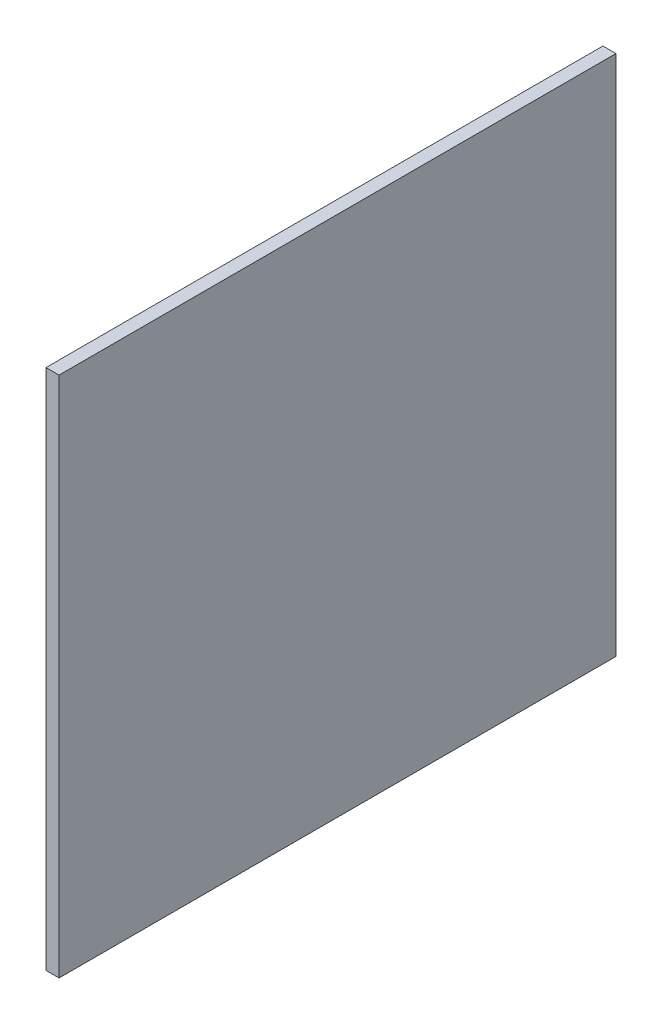
ISO-10303-21;
HEADER;
FILE_DESCRIPTION(('STEP AP214'),'2;1');
FILE_NAME('part.step','',(''),(''),'','','');
FILE_SCHEMA(('AUTOMOTIVE_DESIGN { 1 0 10303 214 1 1 1 1 }'));
ENDSEC;
DATA;
#1=APPLICATION_CONTEXT('core data for automotive mechanical design processes');
#2=APPLICATION_PROTOCOL_DEFINITION('international standard','automotive_design',2000,#1);
#3=PRODUCT_CONTEXT('',#1,'mechanical');
#4=PRODUCT('Part','Part','',(#3));
#5=PRODUCT_RELATED_PRODUCT_CATEGORY('part','',(#4));
#6=PRODUCT_DEFINITION_FORMATION('','',#4);
#7=PRODUCT_DEFINITION_CONTEXT('part definition',#1,'design');
#8=PRODUCT_DEFINITION('design','',#6,#7);
#9=PRODUCT_DEFINITION_SHAPE('','',#8);
#10=(LENGTH_UNIT() NAMED_UNIT(*) SI_UNIT(.MILLI.,.METRE.));
#11=(NAMED_UNIT(*) PLANE_ANGLE_UNIT() SI_UNIT($,.RADIAN.));
#12=(NAMED_UNIT(*) SI_UNIT($,.STERADIAN.) SOLID_ANGLE_UNIT());
#13=UNCERTAINTY_MEASURE_WITH_UNIT(LENGTH_MEASURE(1.E-05),#10,'distance_accuracy_value','');
#14=(GEOMETRIC_REPRESENTATION_CONTEXT(3) GLOBAL_UNCERTAINTY_ASSIGNED_CONTEXT((#13)) GLOBAL_UNIT_ASSIGNED_CONTEXT((#10,
#11,#12)) REPRESENTATION_CONTEXT('',''));
#15=CARTESIAN_POINT('',(0.,0.,0.));
#16=DIRECTION('',(0.,0.,1.));
#17=DIRECTION('',(1.,0.,0.));
#18=AXIS2_PLACEMENT_3D('',#15,#16,#17);
#19=CARTESIAN_POINT('',(-108.534498249528,-3.90321281407813,812.8));
#20=DIRECTION('',(0.,1.,0.));
#21=DIRECTION('',(0.,0.,1.));
#22=AXIS2_PLACEMENT_3D('',#19,#20,#21);
#23=PLANE('',#22);
#24=DIRECTION('',(1.,0.,0.));
#25=VECTOR('',#24,1.);
#26=CARTESIAN_POINT('',(-108.534498249528,-3.90321281407813,0.));
#27=LINE('',#26,#25);
#28=CARTESIAN_POINT('',(-108.534498249528,-3.90321281407813,0.));
#29=VERTEX_POINT('',#28);
#30=CARTESIAN_POINT('',(-89.4844982495275,-3.90321281407813,0.));
#31=VERTEX_POINT('',#30);
#32=EDGE_CURVE('E96',#29,#31,#27,.T.);
#33=ORIENTED_EDGE('',*,*,#32,.T.);
#34=DIRECTION('',(0.,0.,-1.));
#35=VECTOR('',#34,1.);
#36=CARTESIAN_POINT('',(-89.4844982495275,-3.90321281407813,812.8));
#37=LINE('',#36,#35);
#38=CARTESIAN_POINT('',(-89.4844982495275,-3.90321281407813,812.8));
#39=VERTEX_POINT('',#38);
#40=EDGE_CURVE('E11',#39,#31,#37,.T.);
#41=ORIENTED_EDGE('',*,*,#40,.F.);
#42=DIRECTION('',(1.,0.,0.));
#43=VECTOR('',#42,1.);
#44=CARTESIAN_POINT('',(-108.534498249528,-3.90321281407813,812.8));
#45=LINE('',#44,#43);
#46=CARTESIAN_POINT('',(-108.534498249528,-3.90321281407813,812.8));
#47=VERTEX_POINT('',#46);
#48=EDGE_CURVE('E84',#47,#39,#45,.T.);
#49=ORIENTED_EDGE('',*,*,#48,.F.);
#50=DIRECTION('',(0.,0.,-1.));
#51=VECTOR('',#50,1.);
#52=CARTESIAN_POINT('',(-108.534498249528,-3.90321281407813,812.8));
#53=LINE('',#52,#51);
#54=EDGE_CURVE('E92',#47,#29,#53,.T.);
#55=ORIENTED_EDGE('',*,*,#54,.T.);
#56=EDGE_LOOP('',(#33,#41,#49,#55));
#57=FACE_BOUND('',#56,.T.);
#58=ADVANCED_FACE('F33',(#57),#23,.F.);
#59=CARTESIAN_POINT('',(-89.4844982495275,-3.90321281407813,812.8));
#60=DIRECTION('',(-1.,0.,0.));
#61=DIRECTION('',(0.,0.,1.));
#62=AXIS2_PLACEMENT_3D('',#59,#60,#61);
#63=PLANE('',#62);
#64=DIRECTION('',(0.,1.,0.));
#65=VECTOR('',#64,1.);
#66=CARTESIAN_POINT('',(-89.4844982495275,-3.90321281407813,0.));
#67=LINE('',#66,#65);
#68=CARTESIAN_POINT('',(-89.4844982495275,758.096787185922,0.));
#69=VERTEX_POINT('',#68);
#70=EDGE_CURVE('E88',#31,#69,#67,.T.);
#71=ORIENTED_EDGE('',*,*,#70,.T.);
#72=DIRECTION('',(0.,0.,-1.));
#73=VECTOR('',#72,1.);
#74=CARTESIAN_POINT('',(-89.4844982495275,758.096787185922,812.8));
#75=LINE('',#74,#73);
#76=CARTESIAN_POINT('',(-89.4844982495275,758.096787185922,812.8));
#77=VERTEX_POINT('',#76);
#78=EDGE_CURVE('E41',#77,#69,#75,.T.);
#79=ORIENTED_EDGE('',*,*,#78,.F.);
#80=DIRECTION('',(0.,1.,0.));
#81=VECTOR('',#80,1.);
#82=CARTESIAN_POINT('',(-89.4844982495275,-3.90321281407813,812.8));
#83=LINE('',#82,#81);
#84=EDGE_CURVE('E79',#39,#77,#83,.T.);
#85=ORIENTED_EDGE('',*,*,#84,.F.);
#86=ORIENTED_EDGE('',*,*,#40,.T.);
#87=EDGE_LOOP('',(#71,#79,#85,#86));
#88=FACE_BOUND('',#87,.T.);
#89=ADVANCED_FACE('F87',(#88),#63,.F.);
#90=CARTESIAN_POINT('',(-108.534498249528,758.096787185922,812.8));
#91=DIRECTION('',(0.,-1.,0.));
#92=DIRECTION('',(0.,0.,-1.));
#93=AXIS2_PLACEMENT_3D('',#90,#91,#92);
#94=PLANE('',#93);
#95=DIRECTION('',(-1.,0.,0.));
#96=VECTOR('',#95,1.);
#97=CARTESIAN_POINT('',(-108.534498249528,758.096787185922,0.));
#98=LINE('',#97,#96);
#99=CARTESIAN_POINT('',(-108.534498249528,758.096787185922,0.));
#100=VERTEX_POINT('',#99);
#101=EDGE_CURVE('E66',#69,#100,#98,.T.);
#102=ORIENTED_EDGE('',*,*,#101,.T.);
#103=DIRECTION('',(0.,0.,-1.));
#104=VECTOR('',#103,1.);
#105=CARTESIAN_POINT('',(-108.534498249528,758.096787185922,812.8));
#106=LINE('',#105,#104);
#107=CARTESIAN_POINT('',(-108.534498249528,758.096787185922,812.8));
#108=VERTEX_POINT('',#107);
#109=EDGE_CURVE('E89',#108,#100,#106,.T.);
#110=ORIENTED_EDGE('',*,*,#109,.F.);
#111=DIRECTION('',(-1.,0.,0.));
#112=VECTOR('',#111,1.);
#113=CARTESIAN_POINT('',(-108.534498249528,758.096787185922,812.8));
#114=LINE('',#113,#112);
#115=EDGE_CURVE('E82',#77,#108,#114,.T.);
#116=ORIENTED_EDGE('',*,*,#115,.F.);
#117=ORIENTED_EDGE('',*,*,#78,.T.);
#118=EDGE_LOOP('',(#102,#110,#116,#117));
#119=FACE_BOUND('',#118,.T.);
#120=ADVANCED_FACE('F90',(#119),#94,.F.);
#121=CARTESIAN_POINT('',(-108.534498249528,-3.90321281407813,812.8));
#122=DIRECTION('',(1.,0.,0.));
#123=DIRECTION('',(0.,0.,-1.));
#124=AXIS2_PLACEMENT_3D('',#121,#122,#123);
#125=PLANE('',#124);
#126=DIRECTION('',(0.,-1.,0.));
#127=VECTOR('',#126,1.);
#128=CARTESIAN_POINT('',(-108.534498249528,-3.90321281407813,0.));
#129=LINE('',#128,#127);
#130=EDGE_CURVE('E72',#100,#29,#129,.T.);
#131=ORIENTED_EDGE('',*,*,#130,.T.);
#132=ORIENTED_EDGE('',*,*,#54,.F.);
#133=DIRECTION('',(0.,-1.,0.));
#134=VECTOR('',#133,1.);
#135=CARTESIAN_POINT('',(-108.534498249528,-3.90321281407813,812.8));
#136=LINE('',#135,#134);
#137=EDGE_CURVE('E49',#108,#47,#136,.T.);
#138=ORIENTED_EDGE('',*,*,#137,.F.);
#139=ORIENTED_EDGE('',*,*,#109,.T.);
#140=EDGE_LOOP('',(#131,#132,#138,#139));
#141=FACE_BOUND('',#140,.T.);
#142=ADVANCED_FACE('F103',(#141),#125,.F.);
#143=CARTESIAN_POINT('',(0.,0.,812.8));
#144=DIRECTION('',(0.,0.,1.));
#145=DIRECTION('',(1.,0.,0.));
#146=AXIS2_PLACEMENT_3D('',#143,#144,#145);
#147=PLANE('',#146);
#148=ORIENTED_EDGE('',*,*,#48,.T.);
#149=ORIENTED_EDGE('',*,*,#84,.T.);
#150=ORIENTED_EDGE('',*,*,#115,.T.);
#151=ORIENTED_EDGE('',*,*,#137,.T.);
#152=EDGE_LOOP('',(#148,#149,#150,#151));
#153=FACE_BOUND('',#152,.T.);
#154=ADVANCED_FACE('F80',(#153),#147,.T.);
#155=CARTESIAN_POINT('',(0.,0.,0.));
#156=DIRECTION('',(0.,0.,1.));
#157=DIRECTION('',(1.,0.,0.));
#158=AXIS2_PLACEMENT_3D('',#155,#156,#157);
#159=PLANE('',#158);
#160=ORIENTED_EDGE('',*,*,#32,.F.);
#161=ORIENTED_EDGE('',*,*,#130,.F.);
#162=ORIENTED_EDGE('',*,*,#101,.F.);
#163=ORIENTED_EDGE('',*,*,#70,.F.);
#164=EDGE_LOOP('',(#160,#161,#162,#163));
#165=FACE_BOUND('',#164,.T.);
#166=ADVANCED_FACE('F106',(#165),#159,.F.);
#167=CLOSED_SHELL('',(#58,#89,#120,#142,#154,#166));
#168=MANIFOLD_SOLID_BREP('B2',#167);
#169=ADVANCED_BREP_SHAPE_REPRESENTATION('',(#18,#168),#14);
#170=SHAPE_DEFINITION_REPRESENTATION(#9,#169);
ENDSEC;
END-ISO-10303-21;
